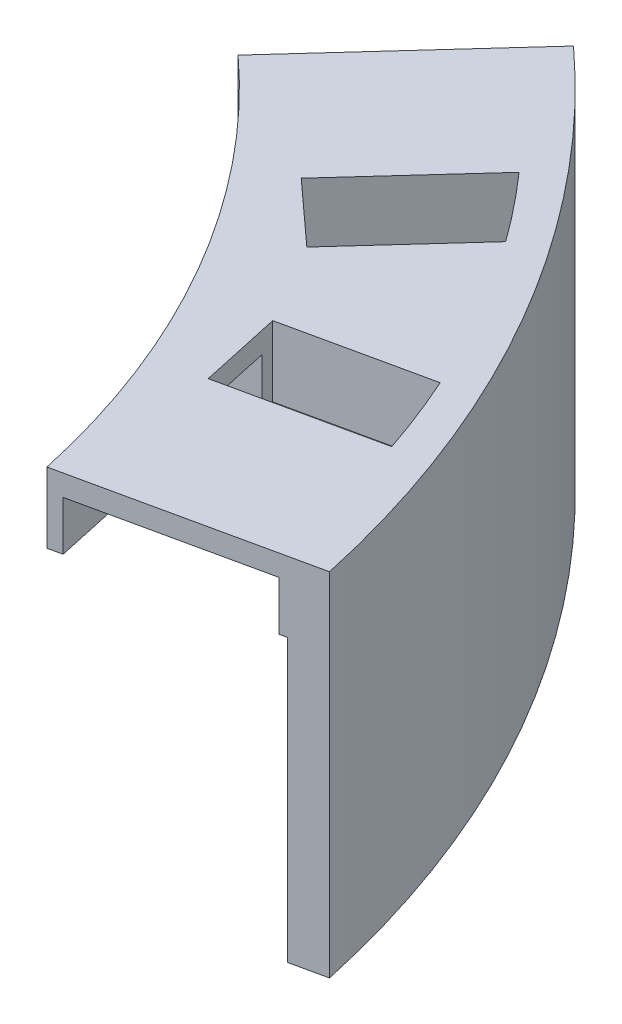
ISO-10303-21;
HEADER;
FILE_DESCRIPTION(('STEP AP214'),'2;1');
FILE_NAME('part.step','',(''),(''),'','','');
FILE_SCHEMA(('AUTOMOTIVE_DESIGN { 1 0 10303 214 1 1 1 1 }'));
ENDSEC;
DATA;
#1=APPLICATION_CONTEXT('core data for automotive mechanical design processes');
#2=APPLICATION_PROTOCOL_DEFINITION('international standard','automotive_design',2000,#1);
#3=PRODUCT_CONTEXT('',#1,'mechanical');
#4=PRODUCT('Part','Part','',(#3));
#5=PRODUCT_RELATED_PRODUCT_CATEGORY('part','',(#4));
#6=PRODUCT_DEFINITION_FORMATION('','',#4);
#7=PRODUCT_DEFINITION_CONTEXT('part definition',#1,'design');
#8=PRODUCT_DEFINITION('design','',#6,#7);
#9=PRODUCT_DEFINITION_SHAPE('','',#8);
#10=(LENGTH_UNIT() NAMED_UNIT(*) SI_UNIT(.MILLI.,.METRE.));
#11=(NAMED_UNIT(*) PLANE_ANGLE_UNIT() SI_UNIT($,.RADIAN.));
#12=(NAMED_UNIT(*) SI_UNIT($,.STERADIAN.) SOLID_ANGLE_UNIT());
#13=UNCERTAINTY_MEASURE_WITH_UNIT(LENGTH_MEASURE(1.E-05),#10,'distance_accuracy_value','');
#14=(GEOMETRIC_REPRESENTATION_CONTEXT(3) GLOBAL_UNCERTAINTY_ASSIGNED_CONTEXT((#13)) GLOBAL_UNIT_ASSIGNED_CONTEXT((#10,
#11,#12)) REPRESENTATION_CONTEXT('',''));
#15=CARTESIAN_POINT('',(0.,0.,0.));
#16=DIRECTION('',(0.,0.,1.));
#17=DIRECTION('',(1.,0.,0.));
#18=AXIS2_PLACEMENT_3D('',#15,#16,#17);
#19=CARTESIAN_POINT('',(169.451754353289,157.279655442511,334.961358152761));
#20=DIRECTION('',(0.,1.,0.));
#21=DIRECTION('',(0.,0.,1.));
#22=AXIS2_PLACEMENT_3D('',#19,#20,#21);
#23=PLANE('',#22);
#24=DIRECTION('',(-0.673038180934669,0.,0.739607738604831));
#25=VECTOR('',#24,1.);
#26=CARTESIAN_POINT('',(249.934035397751,157.279655442511,269.842653238576));
#27=LINE('',#26,#25);
#28=CARTESIAN_POINT('',(249.934035397751,157.279655442511,269.842653238576));
#29=VERTEX_POINT('',#28);
#30=CARTESIAN_POINT('',(244.783731583093,157.279655442511,275.50236863867));
#31=VERTEX_POINT('',#30);
#32=EDGE_CURVE('E277',#29,#31,#27,.T.);
#33=ORIENTED_EDGE('',*,*,#32,.T.);
#34=CARTESIAN_POINT('',(146.661612148435,157.279655442511,348.119252889603));
#35=DIRECTION('',(0.,-1.,0.));
#36=DIRECTION('',(0.,0.,1.));
#37=AXIS2_PLACEMENT_3D('',#34,#35,#36);
#38=CIRCLE('',#37,122.070316623914);
#39=CARTESIAN_POINT('',(228.819595995114,157.279655442511,257.835102060615));
#40=VERTEX_POINT('',#39);
#41=EDGE_CURVE('E404',#40,#31,#38,.T.);
#42=ORIENTED_EDGE('',*,*,#41,.F.);
#43=DIRECTION('',(-0.673038180934674,0.,0.739607738604826));
#44=VECTOR('',#43,1.);
#45=CARTESIAN_POINT('',(228.819595995114,157.279655442511,257.835102060615));
#46=LINE('',#45,#44);
#47=CARTESIAN_POINT('',(230.165672356983,157.279655442511,256.355886583406));
#48=VERTEX_POINT('',#47);
#49=EDGE_CURVE('E401',#48,#40,#46,.T.);
#50=ORIENTED_EDGE('',*,*,#49,.F.);
#51=DIRECTION('',(0.739607738604827,0.,0.673038180934674));
#52=VECTOR('',#51,1.);
#53=CARTESIAN_POINT('',(230.165672356983,157.279655442511,256.355886583406));
#54=LINE('',#53,#52);
#55=CARTESIAN_POINT('',(239.040965220241,157.279655442511,264.432344754622));
#56=VERTEX_POINT('',#55);
#57=EDGE_CURVE('E312',#48,#56,#54,.T.);
#58=ORIENTED_EDGE('',*,*,#57,.T.);
#59=DIRECTION('',(0.673038180934674,0.,-0.739607738604827));
#60=VECTOR('',#59,1.);
#61=CARTESIAN_POINT('',(259.905148829216,157.279655442511,241.504504857872));
#62=LINE('',#61,#60);
#63=CARTESIAN_POINT('',(256.496872448256,157.279655442511,245.249890570108));
#64=VERTEX_POINT('',#63);
#65=EDGE_CURVE('E340',#56,#64,#62,.T.);
#66=ORIENTED_EDGE('',*,*,#65,.T.);
#67=CARTESIAN_POINT('',(169.451754353291,157.279655442511,334.96135815276));
#68=DIRECTION('',(0.,1.,0.));
#69=DIRECTION('',(0.,0.,1.));
#70=AXIS2_PLACEMENT_3D('',#67,#68,#69);
#71=CIRCLE('',#70,124.999999999998);
#72=CARTESIAN_POINT('',(247.492190491782,157.279655442511,237.315619242587));
#73=VERTEX_POINT('',#72);
#74=EDGE_CURVE('E254',#64,#73,#71,.T.);
#75=ORIENTED_EDGE('',*,*,#74,.T.);
#76=DIRECTION('',(0.673038180934676,0.,-0.739607738604825));
#77=VECTOR('',#76,1.);
#78=CARTESIAN_POINT('',(247.492190491782,157.279655442511,237.315619242587));
#79=LINE('',#78,#77);
#80=CARTESIAN_POINT('',(248.165228672717,157.279655442511,236.576011503982));
#81=VERTEX_POINT('',#80);
#82=EDGE_CURVE('E280',#73,#81,#79,.T.);
#83=ORIENTED_EDGE('',*,*,#82,.T.);
#84=CARTESIAN_POINT('',(168.91314031717,157.279655442511,335.272327111504));
#85=DIRECTION('',(0.,-1.,0.));
#86=DIRECTION('',(0.,0.,-1.));
#87=AXIS2_PLACEMENT_3D('',#84,#85,#86);
#88=CIRCLE('',#87,126.577471230922);
#89=CARTESIAN_POINT('',(294.012701070983,157.279655442511,315.98616309639));
#90=VERTEX_POINT('',#89);
#91=EDGE_CURVE('E284',#81,#90,#88,.T.);
#92=ORIENTED_EDGE('',*,*,#91,.T.);
#93=DIRECTION('',(-0.977038180934683,0.,0.213064293103856));
#94=VECTOR('',#93,1.);
#95=CARTESIAN_POINT('',(293.035662890048,157.279655442511,316.199227389494));
#96=LINE('',#95,#94);
#97=CARTESIAN_POINT('',(293.035662890048,157.279655442511,316.199227389494));
#98=VERTEX_POINT('',#97);
#99=EDGE_CURVE('E287',#90,#98,#96,.T.);
#100=ORIENTED_EDGE('',*,*,#99,.T.);
#101=CARTESIAN_POINT('',(290.666723338133,157.279655442511,304.433808398428));
#102=VERTEX_POINT('',#101);
#103=EDGE_CURVE('E278',#98,#102,#71,.T.);
#104=ORIENTED_EDGE('',*,*,#103,.T.);
#105=DIRECTION('',(0.977038180934676,0.,-0.21306429310389));
#106=VECTOR('',#105,1.);
#107=CARTESIAN_POINT('',(168.599497180874,157.279655442511,331.053205429022));
#108=LINE('',#107,#106);
#109=CARTESIAN_POINT('',(265.266137429277,157.279655442511,309.972955165362));
#110=VERTEX_POINT('',#109);
#111=EDGE_CURVE('E438',#110,#102,#108,.T.);
#112=ORIENTED_EDGE('',*,*,#111,.F.);
#113=DIRECTION('',(0.213064293103889,0.,0.977038180934676));
#114=VECTOR('',#113,1.);
#115=CARTESIAN_POINT('',(267.822908946523,157.279655442511,321.697413336578));
#116=LINE('',#115,#114);
#117=CARTESIAN_POINT('',(267.822908946523,157.279655442511,321.697413336578));
#118=VERTEX_POINT('',#117);
#119=EDGE_CURVE('E324',#110,#118,#116,.T.);
#120=ORIENTED_EDGE('',*,*,#119,.T.);
#121=DIRECTION('',(0.977038180934675,0.,-0.213064293103891));
#122=VECTOR('',#121,1.);
#123=CARTESIAN_POINT('',(293.035662890048,157.279655442511,316.199227389494));
#124=LINE('',#123,#122);
#125=CARTESIAN_POINT('',(265.928972248784,157.279655442511,322.110427169161));
#126=VERTEX_POINT('',#125);
#127=EDGE_CURVE('E367',#126,#118,#124,.T.);
#128=ORIENTED_EDGE('',*,*,#127,.F.);
#129=CARTESIAN_POINT('',(258.610738370746,157.279655442511,299.451446911485));
#130=VERTEX_POINT('',#129);
#131=EDGE_CURVE('E403',#130,#126,#38,.T.);
#132=ORIENTED_EDGE('',*,*,#131,.F.);
#133=DIRECTION('',(0.977038180934676,0.,-0.213064293103888));
#134=VECTOR('',#133,1.);
#135=CARTESIAN_POINT('',(266.087347592747,157.279655442511,297.821010670829));
#136=LINE('',#135,#134);
#137=CARTESIAN_POINT('',(266.087347592747,157.279655442511,297.821010670829));
#138=VERTEX_POINT('',#137);
#139=EDGE_CURVE('E262',#130,#138,#136,.T.);
#140=ORIENTED_EDGE('',*,*,#139,.T.);
#141=DIRECTION('',(-0.213064293103888,0.,-0.977038180934676));
#142=VECTOR('',#141,1.);
#143=CARTESIAN_POINT('',(263.956704661708,157.279655442511,288.050628861483));
#144=LINE('',#143,#142);
#145=CARTESIAN_POINT('',(266.513476178954,157.279655442511,299.775087032699));
#146=VERTEX_POINT('',#145);
#147=EDGE_CURVE('E388',#146,#138,#144,.T.);
#148=ORIENTED_EDGE('',*,*,#147,.F.);
#149=DIRECTION('',(-0.977038180934676,0.,0.213064293103886));
#150=VECTOR('',#149,1.);
#151=CARTESIAN_POINT('',(266.513476178954,157.279655442511,299.775087032699));
#152=LINE('',#151,#150);
#153=CARTESIAN_POINT('',(287.927468650043,157.279655442511,295.105303131296));
#154=VERTEX_POINT('',#153);
#155=EDGE_CURVE('E363',#154,#146,#152,.T.);
#156=ORIENTED_EDGE('',*,*,#155,.F.);
#157=CARTESIAN_POINT('',(283.497468280402,157.279655442511,283.789342999405));
#158=VERTEX_POINT('',#157);
#159=EDGE_CURVE('E281',#154,#158,#71,.T.);
#160=ORIENTED_EDGE('',*,*,#159,.T.);
#161=DIRECTION('',(0.977038180934676,0.,-0.213064293103887));
#162=VECTOR('',#161,1.);
#163=CARTESIAN_POINT('',(283.497468280401,157.279655442511,283.789342999405));
#164=LINE('',#163,#162);
#165=CARTESIAN_POINT('',(263.956704661708,157.279655442511,288.050628861483));
#166=VERTEX_POINT('',#165);
#167=EDGE_CURVE('E391',#166,#158,#164,.T.);
#168=ORIENTED_EDGE('',*,*,#167,.F.);
#169=CARTESIAN_POINT('',(264.382833247916,157.279655442511,290.004705223352));
#170=VERTEX_POINT('',#169);
#171=EDGE_CURVE('E387',#170,#166,#144,.T.);
#172=ORIENTED_EDGE('',*,*,#171,.F.);
#173=DIRECTION('',(-0.977038180934676,0.,0.213064293103888));
#174=VECTOR('',#173,1.);
#175=CARTESIAN_POINT('',(264.382833247916,157.279655442511,290.004705223352));
#176=LINE('',#175,#174);
#177=CARTESIAN_POINT('',(255.084107945075,157.279655442511,292.03249325874));
#178=VERTEX_POINT('',#177);
#179=EDGE_CURVE('E268',#170,#178,#176,.T.);
#180=ORIENTED_EDGE('',*,*,#179,.T.);
#181=CARTESIAN_POINT('',(249.445418703033,157.279655442511,282.265997003432));
#182=VERTEX_POINT('',#181);
#183=EDGE_CURVE('E407',#182,#178,#38,.T.);
#184=ORIENTED_EDGE('',*,*,#183,.F.);
#185=DIRECTION('',(0.67303818093467,0.,-0.73960773860483));
#186=VECTOR('',#185,1.);
#187=CARTESIAN_POINT('',(255.85089730659,157.279655442511,275.226958686053));
#188=LINE('',#187,#186);
#189=CARTESIAN_POINT('',(255.85089730659,157.279655442511,275.226958686053));
#190=VERTEX_POINT('',#189);
#191=EDGE_CURVE('E457',#182,#190,#188,.T.);
#192=ORIENTED_EDGE('',*,*,#191,.T.);
#193=DIRECTION('',(-0.73960773860483,0.,-0.67303818093467));
#194=VECTOR('',#193,1.);
#195=CARTESIAN_POINT('',(248.454819920542,157.279655442511,268.496576876706));
#196=LINE('',#195,#194);
#197=CARTESIAN_POINT('',(257.3301127838,157.279655442511,276.573035047922));
#198=VERTEX_POINT('',#197);
#199=EDGE_CURVE('E251',#198,#190,#196,.T.);
#200=ORIENTED_EDGE('',*,*,#199,.F.);
#201=DIRECTION('',(-0.673038180934673,0.,0.739607738604827));
#202=VECTOR('',#201,1.);
#203=CARTESIAN_POINT('',(257.3301127838,157.279655442511,276.573035047922));
#204=LINE('',#203,#202);
#205=CARTESIAN_POINT('',(270.790876402493,157.279655442511,261.780880275826));
#206=VERTEX_POINT('',#205);
#207=EDGE_CURVE('E394',#206,#198,#204,.T.);
#208=ORIENTED_EDGE('',*,*,#207,.F.);
#209=CARTESIAN_POINT('',(263.205967644884,157.279655442511,252.286407350996));
#210=VERTEX_POINT('',#209);
#211=EDGE_CURVE('E488',#206,#210,#71,.T.);
#212=ORIENTED_EDGE('',*,*,#211,.T.);
#213=DIRECTION('',(0.673038180934672,0.,-0.739607738604828));
#214=VECTOR('',#213,1.);
#215=CARTESIAN_POINT('',(263.205967644884,157.279655442511,252.286407350996));
#216=LINE('',#215,#214);
#217=CARTESIAN_POINT('',(248.454819920542,157.279655442511,268.496576876706));
#218=VERTEX_POINT('',#217);
#219=EDGE_CURVE('E398',#218,#210,#216,.T.);
#220=ORIENTED_EDGE('',*,*,#219,.F.);
#221=EDGE_CURVE('E396',#29,#218,#196,.T.);
#222=ORIENTED_EDGE('',*,*,#221,.F.);
#223=EDGE_LOOP('',(#33,#42,#50,#58,#66,#75,#83,#92,#100,#104,#112,#120,#128,#132,#140,#148,#156,
#160,#168,#172,#180,#184,#192,#200,#208,#212,#220,#222));
#224=FACE_BOUND('',#223,.T.);
#225=ADVANCED_FACE('F36',(#224),#23,.F.);
#226=CARTESIAN_POINT('',(263.956704661708,167.279655442511,288.050628861483));
#227=DIRECTION('',(-0.977038180934676,0.,0.213064293103888));
#228=DIRECTION('',(0.213064293103888,0.,0.977038180934676));
#229=AXIS2_PLACEMENT_3D('',#226,#227,#228);
#230=PLANE('',#229);
#231=DIRECTION('',(0.,-1.,0.));
#232=VECTOR('',#231,1.);
#233=CARTESIAN_POINT('',(264.382833247916,164.279655442511,290.004705223352));
#234=LINE('',#233,#232);
#235=CARTESIAN_POINT('',(264.382833247916,164.279655442511,290.004705223352));
#236=VERTEX_POINT('',#235);
#237=EDGE_CURVE('E267',#236,#170,#234,.T.);
#238=ORIENTED_EDGE('',*,*,#237,.T.);
#239=ORIENTED_EDGE('',*,*,#171,.T.);
#240=DIRECTION('',(0.,-1.,0.));
#241=VECTOR('',#240,1.);
#242=CARTESIAN_POINT('',(263.956704661708,167.279655442511,288.050628861483));
#243=LINE('',#242,#241);
#244=CARTESIAN_POINT('',(263.956704661708,167.279655442511,288.050628861483));
#245=VERTEX_POINT('',#244);
#246=EDGE_CURVE('E429',#245,#166,#243,.T.);
#247=ORIENTED_EDGE('',*,*,#246,.F.);
#248=DIRECTION('',(-0.213064293103888,0.,-0.977038180934676));
#249=VECTOR('',#248,1.);
#250=CARTESIAN_POINT('',(263.956704661708,167.279655442511,288.050628861483));
#251=LINE('',#250,#249);
#252=CARTESIAN_POINT('',(266.513476178954,167.279655442511,299.775087032699));
#253=VERTEX_POINT('',#252);
#254=EDGE_CURVE('E366',#253,#245,#251,.T.);
#255=ORIENTED_EDGE('',*,*,#254,.F.);
#256=DIRECTION('',(0.,-1.,0.));
#257=VECTOR('',#256,1.);
#258=CARTESIAN_POINT('',(266.513476178954,167.279655442511,299.775087032699));
#259=LINE('',#258,#257);
#260=EDGE_CURVE('E432',#253,#146,#259,.T.);
#261=ORIENTED_EDGE('',*,*,#260,.T.);
#262=ORIENTED_EDGE('',*,*,#147,.T.);
#263=DIRECTION('',(0.,-1.,0.));
#264=VECTOR('',#263,1.);
#265=CARTESIAN_POINT('',(266.087347592747,164.279655442511,297.821010670829));
#266=LINE('',#265,#264);
#267=CARTESIAN_POINT('',(266.087347592747,164.279655442511,297.821010670829));
#268=VERTEX_POINT('',#267);
#269=EDGE_CURVE('E275',#268,#138,#266,.T.);
#270=ORIENTED_EDGE('',*,*,#269,.F.);
#271=DIRECTION('',(-0.213064293103887,0.,-0.977038180934676));
#272=VECTOR('',#271,1.);
#273=CARTESIAN_POINT('',(264.382833247916,164.279655442511,290.004705223352));
#274=LINE('',#273,#272);
#275=EDGE_CURVE('E264',#268,#236,#274,.T.);
#276=ORIENTED_EDGE('',*,*,#275,.T.);
#277=EDGE_LOOP('',(#238,#239,#247,#255,#261,#262,#270,#276));
#278=FACE_BOUND('',#277,.T.);
#279=ADVANCED_FACE('F503',(#278),#230,.F.);
#280=CARTESIAN_POINT('',(248.454819920542,167.279655442511,268.496576876706));
#281=DIRECTION('',(-0.67303818093467,0.,0.73960773860483));
#282=DIRECTION('',(0.73960773860483,0.,0.67303818093467));
#283=AXIS2_PLACEMENT_3D('',#280,#281,#282);
#284=PLANE('',#283);
#285=DIRECTION('',(0.,-1.,0.));
#286=VECTOR('',#285,1.);
#287=CARTESIAN_POINT('',(249.934035397751,164.279655442511,269.842653238576));
#288=LINE('',#287,#286);
#289=CARTESIAN_POINT('',(249.934035397751,164.279655442511,269.842653238576));
#290=VERTEX_POINT('',#289);
#291=EDGE_CURVE('E245',#290,#29,#288,.T.);
#292=ORIENTED_EDGE('',*,*,#291,.T.);
#293=ORIENTED_EDGE('',*,*,#221,.T.);
#294=DIRECTION('',(0.,-1.,0.));
#295=VECTOR('',#294,1.);
#296=CARTESIAN_POINT('',(248.454819920542,167.279655442511,268.496576876706));
#297=LINE('',#296,#295);
#298=CARTESIAN_POINT('',(248.454819920542,167.279655442511,268.496576876706));
#299=VERTEX_POINT('',#298);
#300=EDGE_CURVE('E418',#299,#218,#297,.T.);
#301=ORIENTED_EDGE('',*,*,#300,.F.);
#302=DIRECTION('',(-0.73960773860483,0.,-0.67303818093467));
#303=VECTOR('',#302,1.);
#304=CARTESIAN_POINT('',(248.454819920542,167.279655442511,268.496576876706));
#305=LINE('',#304,#303);
#306=CARTESIAN_POINT('',(257.3301127838,167.279655442511,276.573035047922));
#307=VERTEX_POINT('',#306);
#308=EDGE_CURVE('E374',#307,#299,#305,.T.);
#309=ORIENTED_EDGE('',*,*,#308,.F.);
#310=DIRECTION('',(0.,-1.,0.));
#311=VECTOR('',#310,1.);
#312=CARTESIAN_POINT('',(257.3301127838,167.279655442511,276.573035047922));
#313=LINE('',#312,#311);
#314=EDGE_CURVE('E421',#307,#198,#313,.T.);
#315=ORIENTED_EDGE('',*,*,#314,.T.);
#316=ORIENTED_EDGE('',*,*,#199,.T.);
#317=DIRECTION('',(0.,-1.,0.));
#318=VECTOR('',#317,1.);
#319=CARTESIAN_POINT('',(255.85089730659,164.279655442511,275.226958686053));
#320=LINE('',#319,#318);
#321=CARTESIAN_POINT('',(255.85089730659,164.279655442511,275.226958686053));
#322=VERTEX_POINT('',#321);
#323=EDGE_CURVE('E232',#322,#190,#320,.T.);
#324=ORIENTED_EDGE('',*,*,#323,.F.);
#325=DIRECTION('',(-0.73960773860483,0.,-0.67303818093467));
#326=VECTOR('',#325,1.);
#327=CARTESIAN_POINT('',(249.934035397751,164.279655442511,269.842653238576));
#328=LINE('',#327,#326);
#329=EDGE_CURVE('E236',#322,#290,#328,.T.);
#330=ORIENTED_EDGE('',*,*,#329,.T.);
#331=EDGE_LOOP('',(#292,#293,#301,#309,#315,#316,#324,#330));
#332=FACE_BOUND('',#331,.T.);
#333=ADVANCED_FACE('F248',(#332),#284,.F.);
#334=CARTESIAN_POINT('',(146.661612148435,167.279655442511,348.119252889603));
#335=DIRECTION('',(0.,-1.,0.));
#336=DIRECTION('',(0.,0.,-1.));
#337=AXIS2_PLACEMENT_3D('',#334,#335,#336);
#338=CYLINDRICAL_SURFACE('',#337,122.070316623914);
#339=DIRECTION('',(0.,-1.,0.));
#340=VECTOR('',#339,1.);
#341=CARTESIAN_POINT('',(244.783731583093,167.279655442511,275.50236863867));
#342=LINE('',#341,#340);
#343=CARTESIAN_POINT('',(244.783731583093,164.279655442511,275.50236863867));
#344=VERTEX_POINT('',#343);
#345=EDGE_CURVE('E11',#344,#31,#342,.T.);
#346=ORIENTED_EDGE('',*,*,#345,.F.);
#347=CARTESIAN_POINT('',(146.661612148435,164.279655442511,348.119252889603));
#348=DIRECTION('',(0.,1.,0.));
#349=DIRECTION('',(0.,0.,1.));
#350=AXIS2_PLACEMENT_3D('',#347,#348,#349);
#351=CIRCLE('',#350,122.070316623914);
#352=CARTESIAN_POINT('',(249.445418703033,164.279655442511,282.265997003432));
#353=VERTEX_POINT('',#352);
#354=EDGE_CURVE('E448',#344,#353,#351,.F.);
#355=ORIENTED_EDGE('',*,*,#354,.T.);
#356=DIRECTION('',(0.,-1.,0.));
#357=VECTOR('',#356,1.);
#358=CARTESIAN_POINT('',(249.445418703033,167.279655442511,282.265997003432));
#359=LINE('',#358,#357);
#360=EDGE_CURVE('E44',#182,#353,#359,.F.);
#361=ORIENTED_EDGE('',*,*,#360,.F.);
#362=ORIENTED_EDGE('',*,*,#183,.T.);
#363=DIRECTION('',(0.,-1.,0.));
#364=VECTOR('',#363,1.);
#365=CARTESIAN_POINT('',(255.084107945075,167.279655442511,292.03249325874));
#366=LINE('',#365,#364);
#367=CARTESIAN_POINT('',(255.084107945075,164.279655442511,292.03249325874));
#368=VERTEX_POINT('',#367);
#369=EDGE_CURVE('E446',#368,#178,#366,.T.);
#370=ORIENTED_EDGE('',*,*,#369,.F.);
#371=CARTESIAN_POINT('',(146.661612148435,164.279655442511,348.119252889603));
#372=DIRECTION('',(0.,1.,0.));
#373=DIRECTION('',(0.,0.,1.));
#374=AXIS2_PLACEMENT_3D('',#371,#372,#373);
#375=CIRCLE('',#374,122.070316623914);
#376=CARTESIAN_POINT('',(258.610738370746,164.279655442511,299.451446911485));
#377=VERTEX_POINT('',#376);
#378=EDGE_CURVE('E441',#368,#377,#375,.F.);
#379=ORIENTED_EDGE('',*,*,#378,.T.);
#380=DIRECTION('',(0.,-1.,0.));
#381=VECTOR('',#380,1.);
#382=CARTESIAN_POINT('',(258.610738370746,167.279655442511,299.451446911485));
#383=LINE('',#382,#381);
#384=EDGE_CURVE('E444',#130,#377,#383,.F.);
#385=ORIENTED_EDGE('',*,*,#384,.F.);
#386=ORIENTED_EDGE('',*,*,#131,.T.);
#387=DIRECTION('',(0.,-1.,0.));
#388=VECTOR('',#387,1.);
#389=CARTESIAN_POINT('',(265.928972248784,167.279655442511,322.110427169161));
#390=LINE('',#389,#388);
#391=CARTESIAN_POINT('',(265.928972248784,167.279655442511,322.110427169161));
#392=VERTEX_POINT('',#391);
#393=EDGE_CURVE('E385',#392,#126,#390,.T.);
#394=ORIENTED_EDGE('',*,*,#393,.F.);
#395=CARTESIAN_POINT('',(146.661612148435,167.279655442511,348.119252889603));
#396=DIRECTION('',(0.,-1.,0.));
#397=DIRECTION('',(0.,0.,1.));
#398=AXIS2_PLACEMENT_3D('',#395,#396,#397);
#399=CIRCLE('',#398,122.070316623914);
#400=CARTESIAN_POINT('',(228.819595995114,167.279655442511,257.835102060615));
#401=VERTEX_POINT('',#400);
#402=EDGE_CURVE('E381',#401,#392,#399,.T.);
#403=ORIENTED_EDGE('',*,*,#402,.F.);
#404=DIRECTION('',(0.,-1.,0.));
#405=VECTOR('',#404,1.);
#406=CARTESIAN_POINT('',(228.819595995114,167.279655442511,257.835102060615));
#407=LINE('',#406,#405);
#408=EDGE_CURVE('E412',#401,#40,#407,.T.);
#409=ORIENTED_EDGE('',*,*,#408,.T.);
#410=ORIENTED_EDGE('',*,*,#41,.T.);
#411=EDGE_LOOP('',(#346,#355,#361,#362,#370,#379,#385,#386,#394,#403,#409,#410));
#412=FACE_BOUND('',#411,.T.);
#413=ADVANCED_FACE('F451',(#412),#338,.F.);
#414=CARTESIAN_POINT('',(169.45175435329,117.279655442511,334.961358152761));
#415=DIRECTION('',(0.,1.,0.));
#416=DIRECTION('',(0.,0.,1.));
#417=AXIS2_PLACEMENT_3D('',#414,#415,#416);
#418=CYLINDRICAL_SURFACE('',#417,125.);
#419=ORIENTED_EDGE('',*,*,#103,.F.);
#420=DIRECTION('',(0.,1.,0.));
#421=VECTOR('',#420,1.);
#422=CARTESIAN_POINT('',(293.035662890048,117.279655442511,316.199227389494));
#423=LINE('',#422,#421);
#424=CARTESIAN_POINT('',(293.035662890048,164.279655442511,316.199227389494));
#425=VERTEX_POINT('',#424);
#426=EDGE_CURVE('E304',#98,#425,#423,.T.);
#427=ORIENTED_EDGE('',*,*,#426,.T.);
#428=CARTESIAN_POINT('',(169.451754353289,164.279655442511,334.961358152761));
#429=DIRECTION('',(0.,1.,0.));
#430=DIRECTION('',(0.,0.,1.));
#431=AXIS2_PLACEMENT_3D('',#428,#429,#430);
#432=CIRCLE('',#431,125.);
#433=CARTESIAN_POINT('',(290.666723338133,164.279655442511,304.433808398428));
#434=VERTEX_POINT('',#433);
#435=EDGE_CURVE('E358',#425,#434,#432,.T.);
#436=ORIENTED_EDGE('',*,*,#435,.T.);
#437=DIRECTION('',(0.,-1.,0.));
#438=VECTOR('',#437,1.);
#439=CARTESIAN_POINT('',(290.666723338133,167.279655442511,304.433808398428));
#440=LINE('',#439,#438);
#441=EDGE_CURVE('E355',#102,#434,#440,.F.);
#442=ORIENTED_EDGE('',*,*,#441,.F.);
#443=EDGE_LOOP('',(#419,#427,#436,#442));
#444=FACE_BOUND('',#443,.T.);
#445=ADVANCED_FACE('F528',(#444),#418,.F.);
#446=ORIENTED_EDGE('',*,*,#159,.F.);
#447=DIRECTION('',(0.,-1.,0.));
#448=VECTOR('',#447,1.);
#449=CARTESIAN_POINT('',(287.927468650043,167.279655442511,295.105303131296));
#450=LINE('',#449,#448);
#451=CARTESIAN_POINT('',(287.927468650043,167.279655442511,295.105303131296));
#452=VERTEX_POINT('',#451);
#453=EDGE_CURVE('E435',#452,#154,#450,.T.);
#454=ORIENTED_EDGE('',*,*,#453,.F.);
#455=CARTESIAN_POINT('',(169.45175435329,167.279655442511,334.961358152761));
#456=DIRECTION('',(0.,-1.,0.));
#457=DIRECTION('',(0.,0.,-1.));
#458=AXIS2_PLACEMENT_3D('',#455,#456,#457);
#459=CIRCLE('',#458,125.);
#460=CARTESIAN_POINT('',(283.497468280401,167.279655442511,283.789342999405));
#461=VERTEX_POINT('',#460);
#462=EDGE_CURVE('E293',#461,#452,#459,.T.);
#463=ORIENTED_EDGE('',*,*,#462,.F.);
#464=DIRECTION('',(0.,-1.,0.));
#465=VECTOR('',#464,1.);
#466=CARTESIAN_POINT('',(283.497468280401,167.279655442511,283.789342999405));
#467=LINE('',#466,#465);
#468=EDGE_CURVE('E426',#461,#158,#467,.T.);
#469=ORIENTED_EDGE('',*,*,#468,.T.);
#470=EDGE_LOOP('',(#446,#454,#463,#469));
#471=FACE_BOUND('',#470,.T.);
#472=ADVANCED_FACE('F496',(#471),#418,.F.);
#473=ORIENTED_EDGE('',*,*,#211,.F.);
#474=DIRECTION('',(0.,-1.,0.));
#475=VECTOR('',#474,1.);
#476=CARTESIAN_POINT('',(270.790876402493,167.279655442511,261.780880275826));
#477=LINE('',#476,#475);
#478=CARTESIAN_POINT('',(270.790876402493,167.279655442511,261.780880275826));
#479=VERTEX_POINT('',#478);
#480=EDGE_CURVE('E423',#479,#206,#477,.T.);
#481=ORIENTED_EDGE('',*,*,#480,.F.);
#482=CARTESIAN_POINT('',(263.205967644884,167.279655442511,252.286407350996));
#483=VERTEX_POINT('',#482);
#484=EDGE_CURVE('E307',#483,#479,#459,.T.);
#485=ORIENTED_EDGE('',*,*,#484,.F.);
#486=DIRECTION('',(0.,-1.,0.));
#487=VECTOR('',#486,1.);
#488=CARTESIAN_POINT('',(263.205967644884,167.279655442511,252.286407350996));
#489=LINE('',#488,#487);
#490=EDGE_CURVE('E415',#483,#210,#489,.T.);
#491=ORIENTED_EDGE('',*,*,#490,.T.);
#492=EDGE_LOOP('',(#473,#481,#485,#491));
#493=FACE_BOUND('',#492,.T.);
#494=ADVANCED_FACE('F555',(#493),#418,.F.);
#495=CARTESIAN_POINT('',(228.819595995114,167.279655442511,257.835102060615));
#496=DIRECTION('',(0.739607738604826,0.,0.673038180934674));
#497=DIRECTION('',(0.673038180934674,0.,-0.739607738604826));
#498=AXIS2_PLACEMENT_3D('',#495,#496,#497);
#499=PLANE('',#498);
#500=DIRECTION('',(-0.673038180934676,0.,0.739607738604825));
#501=VECTOR('',#500,1.);
#502=CARTESIAN_POINT('',(251.53041957739,117.279655442511,232.877972810958));
#503=LINE('',#502,#501);
#504=CARTESIAN_POINT('',(251.53041957739,117.279655442511,232.877972810958));
#505=VERTEX_POINT('',#504);
#506=CARTESIAN_POINT('',(248.165228672717,117.279655442511,236.576011503982));
#507=VERTEX_POINT('',#506);
#508=EDGE_CURVE('E301',#505,#507,#503,.T.);
#509=ORIENTED_EDGE('',*,*,#508,.T.);
#510=DIRECTION('',(0.,-1.,0.));
#511=VECTOR('',#510,1.);
#512=CARTESIAN_POINT('',(248.165228672717,157.279655442511,236.576011503982));
#513=LINE('',#512,#511);
#514=EDGE_CURVE('E288',#81,#507,#513,.T.);
#515=ORIENTED_EDGE('',*,*,#514,.F.);
#516=ORIENTED_EDGE('',*,*,#82,.F.);
#517=DIRECTION('',(0.,1.,0.));
#518=VECTOR('',#517,1.);
#519=CARTESIAN_POINT('',(247.492190491782,117.279655442511,237.315619242587));
#520=LINE('',#519,#518);
#521=CARTESIAN_POINT('',(247.492190491782,164.279655442511,237.315619242587));
#522=VERTEX_POINT('',#521);
#523=EDGE_CURVE('E310',#73,#522,#520,.T.);
#524=ORIENTED_EDGE('',*,*,#523,.T.);
#525=DIRECTION('',(-0.673038180934673,0.,0.739607738604827));
#526=VECTOR('',#525,1.);
#527=CARTESIAN_POINT('',(251.029855965958,164.279655442511,233.428046686656));
#528=LINE('',#527,#526);
#529=CARTESIAN_POINT('',(230.165672356983,164.279655442511,256.355886583406));
#530=VERTEX_POINT('',#529);
#531=EDGE_CURVE('E336',#522,#530,#528,.T.);
#532=ORIENTED_EDGE('',*,*,#531,.T.);
#533=DIRECTION('',(0.,-1.,0.));
#534=VECTOR('',#533,1.);
#535=CARTESIAN_POINT('',(230.165672356983,164.279655442511,256.355886583406));
#536=LINE('',#535,#534);
#537=EDGE_CURVE('E331',#530,#48,#536,.T.);
#538=ORIENTED_EDGE('',*,*,#537,.T.);
#539=ORIENTED_EDGE('',*,*,#49,.T.);
#540=ORIENTED_EDGE('',*,*,#408,.F.);
#541=DIRECTION('',(-0.673038180934674,0.,0.739607738604826));
#542=VECTOR('',#541,1.);
#543=CARTESIAN_POINT('',(228.819595995114,167.279655442511,257.835102060615));
#544=LINE('',#543,#542);
#545=CARTESIAN_POINT('',(251.53041957739,167.279655442511,232.877972810958));
#546=VERTEX_POINT('',#545);
#547=EDGE_CURVE('E379',#546,#401,#544,.T.);
#548=ORIENTED_EDGE('',*,*,#547,.F.);
#549=DIRECTION('',(0.,1.,0.));
#550=VECTOR('',#549,1.);
#551=CARTESIAN_POINT('',(251.53041957739,117.279655442511,232.877972810958));
#552=LINE('',#551,#550);
#553=EDGE_CURVE('E313',#505,#546,#552,.T.);
#554=ORIENTED_EDGE('',*,*,#553,.F.);
#555=EDGE_LOOP('',(#509,#515,#516,#524,#532,#538,#539,#540,#548,#554));
#556=FACE_BOUND('',#555,.T.);
#557=ADVANCED_FACE('F469',(#556),#499,.F.);
#558=CARTESIAN_POINT('',(293.035662890048,167.279655442511,316.199227389494));
#559=DIRECTION('',(-0.213064293103891,0.,-0.977038180934675));
#560=DIRECTION('',(-0.977038180934675,0.,0.213064293103891));
#561=AXIS2_PLACEMENT_3D('',#558,#559,#560);
#562=PLANE('',#561);
#563=ORIENTED_EDGE('',*,*,#99,.F.);
#564=DIRECTION('',(0.,-1.,0.));
#565=VECTOR('',#564,1.);
#566=CARTESIAN_POINT('',(294.012701070983,157.279655442511,315.98616309639));
#567=LINE('',#566,#565);
#568=CARTESIAN_POINT('',(294.012701070983,117.279655442511,315.98616309639));
#569=VERTEX_POINT('',#568);
#570=EDGE_CURVE('E290',#90,#569,#567,.T.);
#571=ORIENTED_EDGE('',*,*,#570,.T.);
#572=DIRECTION('',(0.977038180934678,0.,-0.213064293103878));
#573=VECTOR('',#572,1.);
#574=CARTESIAN_POINT('',(293.035662890048,117.279655442511,316.199227389494));
#575=LINE('',#574,#573);
#576=CARTESIAN_POINT('',(298.897891975657,117.279655442511,314.920841630871));
#577=VERTEX_POINT('',#576);
#578=EDGE_CURVE('E295',#569,#577,#575,.T.);
#579=ORIENTED_EDGE('',*,*,#578,.T.);
#580=DIRECTION('',(0.,1.,0.));
#581=VECTOR('',#580,1.);
#582=CARTESIAN_POINT('',(298.897891975657,117.279655442511,314.920841630871));
#583=LINE('',#582,#581);
#584=CARTESIAN_POINT('',(298.897891975657,167.279655442511,314.920841630871));
#585=VERTEX_POINT('',#584);
#586=EDGE_CURVE('E316',#577,#585,#583,.T.);
#587=ORIENTED_EDGE('',*,*,#586,.T.);
#588=DIRECTION('',(0.977038180934675,0.,-0.213064293103891));
#589=VECTOR('',#588,1.);
#590=CARTESIAN_POINT('',(293.035662890048,167.279655442511,316.199227389494));
#591=LINE('',#590,#589);
#592=EDGE_CURVE('E383',#392,#585,#591,.T.);
#593=ORIENTED_EDGE('',*,*,#592,.F.);
#594=ORIENTED_EDGE('',*,*,#393,.T.);
#595=ORIENTED_EDGE('',*,*,#127,.T.);
#596=DIRECTION('',(0.,-1.,0.));
#597=VECTOR('',#596,1.);
#598=CARTESIAN_POINT('',(267.822908946523,164.279655442511,321.697413336578));
#599=LINE('',#598,#597);
#600=CARTESIAN_POINT('',(267.822908946523,164.279655442511,321.697413336578));
#601=VERTEX_POINT('',#600);
#602=EDGE_CURVE('E328',#601,#118,#599,.T.);
#603=ORIENTED_EDGE('',*,*,#602,.F.);
#604=DIRECTION('',(0.977038180934675,0.,-0.213064293103891));
#605=VECTOR('',#604,1.);
#606=CARTESIAN_POINT('',(267.822908946523,164.279655442511,321.697413336578));
#607=LINE('',#606,#605);
#608=EDGE_CURVE('E320',#601,#425,#607,.T.);
#609=ORIENTED_EDGE('',*,*,#608,.T.);
#610=ORIENTED_EDGE('',*,*,#426,.F.);
#611=EDGE_LOOP('',(#563,#571,#579,#587,#593,#594,#595,#603,#609,#610));
#612=FACE_BOUND('',#611,.T.);
#613=ADVANCED_FACE('F511',(#612),#562,.F.);
#614=CARTESIAN_POINT('',(266.513476178954,167.279655442511,299.775087032699));
#615=DIRECTION('',(0.213064293103886,0.,0.977038180934676));
#616=DIRECTION('',(0.977038180934676,0.,-0.213064293103886));
#617=AXIS2_PLACEMENT_3D('',#614,#615,#616);
#618=PLANE('',#617);
#619=ORIENTED_EDGE('',*,*,#155,.T.);
#620=ORIENTED_EDGE('',*,*,#260,.F.);
#621=DIRECTION('',(-0.977038180934676,0.,0.213064293103886));
#622=VECTOR('',#621,1.);
#623=CARTESIAN_POINT('',(266.513476178954,167.279655442511,299.775087032699));
#624=LINE('',#623,#622);
#625=EDGE_CURVE('E364',#452,#253,#624,.T.);
#626=ORIENTED_EDGE('',*,*,#625,.F.);
#627=ORIENTED_EDGE('',*,*,#453,.T.);
#628=EDGE_LOOP('',(#619,#620,#626,#627));
#629=FACE_BOUND('',#628,.T.);
#630=ADVANCED_FACE('F38',(#629),#618,.F.);
#631=CARTESIAN_POINT('',(283.497468280401,167.279655442511,283.789342999405));
#632=DIRECTION('',(-0.213064293103887,0.,-0.977038180934676));
#633=DIRECTION('',(-0.977038180934676,0.,0.213064293103887));
#634=AXIS2_PLACEMENT_3D('',#631,#632,#633);
#635=PLANE('',#634);
#636=ORIENTED_EDGE('',*,*,#167,.T.);
#637=ORIENTED_EDGE('',*,*,#468,.F.);
#638=DIRECTION('',(0.977038180934676,0.,-0.213064293103887));
#639=VECTOR('',#638,1.);
#640=CARTESIAN_POINT('',(283.497468280401,167.279655442511,283.789342999405));
#641=LINE('',#640,#639);
#642=EDGE_CURVE('E369',#245,#461,#641,.T.);
#643=ORIENTED_EDGE('',*,*,#642,.F.);
#644=ORIENTED_EDGE('',*,*,#246,.T.);
#645=EDGE_LOOP('',(#636,#637,#643,#644));
#646=FACE_BOUND('',#645,.T.);
#647=ADVANCED_FACE('F499',(#646),#635,.F.);
#648=CARTESIAN_POINT('',(257.3301127838,167.279655442511,276.573035047922));
#649=DIRECTION('',(0.739607738604827,0.,0.673038180934673));
#650=DIRECTION('',(0.673038180934673,0.,-0.739607738604827));
#651=AXIS2_PLACEMENT_3D('',#648,#649,#650);
#652=PLANE('',#651);
#653=ORIENTED_EDGE('',*,*,#207,.T.);
#654=ORIENTED_EDGE('',*,*,#314,.F.);
#655=DIRECTION('',(-0.673038180934673,0.,0.739607738604827));
#656=VECTOR('',#655,1.);
#657=CARTESIAN_POINT('',(257.3301127838,167.279655442511,276.573035047922));
#658=LINE('',#657,#656);
#659=EDGE_CURVE('E372',#479,#307,#658,.T.);
#660=ORIENTED_EDGE('',*,*,#659,.F.);
#661=ORIENTED_EDGE('',*,*,#480,.T.);
#662=EDGE_LOOP('',(#653,#654,#660,#661));
#663=FACE_BOUND('',#662,.T.);
#664=ADVANCED_FACE('F559',(#663),#652,.F.);
#665=CARTESIAN_POINT('',(263.205967644884,167.279655442511,252.286407350996));
#666=DIRECTION('',(-0.739607738604828,0.,-0.673038180934672));
#667=DIRECTION('',(-0.673038180934672,0.,0.739607738604828));
#668=AXIS2_PLACEMENT_3D('',#665,#666,#667);
#669=PLANE('',#668);
#670=ORIENTED_EDGE('',*,*,#219,.T.);
#671=ORIENTED_EDGE('',*,*,#490,.F.);
#672=DIRECTION('',(0.673038180934672,0.,-0.739607738604828));
#673=VECTOR('',#672,1.);
#674=CARTESIAN_POINT('',(263.205967644884,167.279655442511,252.286407350996));
#675=LINE('',#674,#673);
#676=EDGE_CURVE('E376',#299,#483,#675,.T.);
#677=ORIENTED_EDGE('',*,*,#676,.F.);
#678=ORIENTED_EDGE('',*,*,#300,.T.);
#679=EDGE_LOOP('',(#670,#671,#677,#678));
#680=FACE_BOUND('',#679,.T.);
#681=ADVANCED_FACE('F556',(#680),#669,.F.);
#682=CARTESIAN_POINT('',(169.451754353289,167.279655442511,334.961358152761));
#683=DIRECTION('',(0.,1.,0.));
#684=DIRECTION('',(0.,0.,1.));
#685=AXIS2_PLACEMENT_3D('',#682,#683,#684);
#686=PLANE('',#685);
#687=CARTESIAN_POINT('',(146.661612148434,167.279655442511,348.119252889604));
#688=DIRECTION('',(0.,1.,0.));
#689=DIRECTION('',(0.,0.,-1.));
#690=AXIS2_PLACEMENT_3D('',#687,#688,#689);
#691=CIRCLE('',#690,155.814053941667);
#692=EDGE_CURVE('E298',#585,#546,#691,.T.);
#693=ORIENTED_EDGE('',*,*,#692,.T.);
#694=ORIENTED_EDGE('',*,*,#547,.T.);
#695=ORIENTED_EDGE('',*,*,#402,.T.);
#696=ORIENTED_EDGE('',*,*,#592,.T.);
#697=EDGE_LOOP('',(#693,#694,#695,#696));
#698=FACE_BOUND('',#697,.T.);
#699=ORIENTED_EDGE('',*,*,#484,.T.);
#700=ORIENTED_EDGE('',*,*,#659,.T.);
#701=ORIENTED_EDGE('',*,*,#308,.T.);
#702=ORIENTED_EDGE('',*,*,#676,.T.);
#703=EDGE_LOOP('',(#699,#700,#701,#702));
#704=FACE_BOUND('',#703,.T.);
#705=ORIENTED_EDGE('',*,*,#642,.T.);
#706=ORIENTED_EDGE('',*,*,#462,.T.);
#707=ORIENTED_EDGE('',*,*,#625,.T.);
#708=ORIENTED_EDGE('',*,*,#254,.T.);
#709=EDGE_LOOP('',(#705,#706,#707,#708));
#710=FACE_BOUND('',#709,.T.);
#711=ADVANCED_FACE('F547',(#698,#704,#710),#686,.T.);
#712=CARTESIAN_POINT('',(0.,164.279655442511,0.));
#713=DIRECTION('',(0.,-1.,0.));
#714=DIRECTION('',(0.,0.,-1.));
#715=AXIS2_PLACEMENT_3D('',#712,#713,#714);
#716=PLANE('',#715);
#717=CARTESIAN_POINT('',(169.451754353289,164.279655442511,334.961358152761));
#718=DIRECTION('',(0.,-1.,0.));
#719=DIRECTION('',(0.,0.,-1.));
#720=AXIS2_PLACEMENT_3D('',#717,#718,#719);
#721=CIRCLE('',#720,125.);
#722=CARTESIAN_POINT('',(256.496872448256,164.279655442511,245.249890570108));
#723=VERTEX_POINT('',#722);
#724=EDGE_CURVE('E360',#522,#723,#721,.T.);
#725=ORIENTED_EDGE('',*,*,#724,.T.);
#726=DIRECTION('',(0.673038180934674,0.,-0.739607738604827));
#727=VECTOR('',#726,1.);
#728=CARTESIAN_POINT('',(259.905148829216,164.279655442511,241.504504857872));
#729=LINE('',#728,#727);
#730=CARTESIAN_POINT('',(239.040965220241,164.279655442511,264.432344754622));
#731=VERTEX_POINT('',#730);
#732=EDGE_CURVE('E342',#731,#723,#729,.T.);
#733=ORIENTED_EDGE('',*,*,#732,.F.);
#734=DIRECTION('',(0.739607738604827,0.,0.673038180934674));
#735=VECTOR('',#734,1.);
#736=CARTESIAN_POINT('',(230.165672356983,164.279655442511,256.355886583406));
#737=LINE('',#736,#735);
#738=EDGE_CURVE('E339',#530,#731,#737,.T.);
#739=ORIENTED_EDGE('',*,*,#738,.F.);
#740=ORIENTED_EDGE('',*,*,#531,.F.);
#741=EDGE_LOOP('',(#725,#733,#739,#740));
#742=FACE_BOUND('',#741,.T.);
#743=ADVANCED_FACE('F484',(#742),#716,.T.);
#744=CARTESIAN_POINT('',(259.905148829216,164.279655442511,241.504504857872));
#745=DIRECTION('',(-0.739607738604827,0.,-0.673038180934674));
#746=DIRECTION('',(-0.673038180934674,0.,0.739607738604827));
#747=AXIS2_PLACEMENT_3D('',#744,#745,#746);
#748=PLANE('',#747);
#749=DIRECTION('',(0.,-1.,0.));
#750=VECTOR('',#749,1.);
#751=CARTESIAN_POINT('',(256.496872448256,167.279655442511,245.249890570108));
#752=LINE('',#751,#750);
#753=EDGE_CURVE('E335',#723,#64,#752,.T.);
#754=ORIENTED_EDGE('',*,*,#753,.T.);
#755=ORIENTED_EDGE('',*,*,#65,.F.);
#756=DIRECTION('',(0.,-1.,0.));
#757=VECTOR('',#756,1.);
#758=CARTESIAN_POINT('',(239.040965220241,164.279655442511,264.432344754622));
#759=LINE('',#758,#757);
#760=EDGE_CURVE('E345',#731,#56,#759,.T.);
#761=ORIENTED_EDGE('',*,*,#760,.F.);
#762=ORIENTED_EDGE('',*,*,#732,.T.);
#763=EDGE_LOOP('',(#754,#755,#761,#762));
#764=FACE_BOUND('',#763,.T.);
#765=ADVANCED_FACE('F477',(#764),#748,.T.);
#766=CARTESIAN_POINT('',(230.165672356983,164.279655442511,256.355886583406));
#767=DIRECTION('',(0.673038180934674,0.,-0.739607738604827));
#768=DIRECTION('',(-0.739607738604827,0.,-0.673038180934674));
#769=AXIS2_PLACEMENT_3D('',#766,#767,#768);
#770=PLANE('',#769);
#771=ORIENTED_EDGE('',*,*,#57,.F.);
#772=ORIENTED_EDGE('',*,*,#537,.F.);
#773=ORIENTED_EDGE('',*,*,#738,.T.);
#774=ORIENTED_EDGE('',*,*,#760,.T.);
#775=EDGE_LOOP('',(#771,#772,#773,#774));
#776=FACE_BOUND('',#775,.T.);
#777=ADVANCED_FACE('F472',(#776),#770,.T.);
#778=CARTESIAN_POINT('',(0.,164.279655442511,0.));
#779=DIRECTION('',(0.,1.,0.));
#780=DIRECTION('',(0.,0.,1.));
#781=AXIS2_PLACEMENT_3D('',#778,#779,#780);
#782=PLANE('',#781);
#783=ORIENTED_EDGE('',*,*,#608,.F.);
#784=DIRECTION('',(0.213064293103889,0.,0.977038180934676));
#785=VECTOR('',#784,1.);
#786=CARTESIAN_POINT('',(267.822908946523,164.279655442511,321.697413336578));
#787=LINE('',#786,#785);
#788=CARTESIAN_POINT('',(265.266137429277,164.279655442511,309.972955165362));
#789=VERTEX_POINT('',#788);
#790=EDGE_CURVE('E326',#789,#601,#787,.T.);
#791=ORIENTED_EDGE('',*,*,#790,.F.);
#792=DIRECTION('',(-0.977038180934676,0.,0.21306429310389));
#793=VECTOR('',#792,1.);
#794=CARTESIAN_POINT('',(265.266137429277,164.279655442511,309.972955165362));
#795=LINE('',#794,#793);
#796=EDGE_CURVE('E323',#434,#789,#795,.T.);
#797=ORIENTED_EDGE('',*,*,#796,.F.);
#798=ORIENTED_EDGE('',*,*,#435,.F.);
#799=EDGE_LOOP('',(#783,#791,#797,#798));
#800=FACE_BOUND('',#799,.T.);
#801=ADVANCED_FACE('F523',(#800),#782,.F.);
#802=CARTESIAN_POINT('',(265.266137429277,164.279655442511,309.972955165362));
#803=DIRECTION('',(0.21306429310389,0.,0.977038180934675));
#804=DIRECTION('',(0.977038180934676,0.,-0.21306429310389));
#805=AXIS2_PLACEMENT_3D('',#802,#803,#804);
#806=PLANE('',#805);
#807=ORIENTED_EDGE('',*,*,#441,.T.);
#808=ORIENTED_EDGE('',*,*,#796,.T.);
#809=DIRECTION('',(0.,-1.,0.));
#810=VECTOR('',#809,1.);
#811=CARTESIAN_POINT('',(265.266137429277,164.279655442511,309.972955165362));
#812=LINE('',#811,#810);
#813=EDGE_CURVE('E333',#789,#110,#812,.T.);
#814=ORIENTED_EDGE('',*,*,#813,.T.);
#815=ORIENTED_EDGE('',*,*,#111,.T.);
#816=EDGE_LOOP('',(#807,#808,#814,#815));
#817=FACE_BOUND('',#816,.T.);
#818=ADVANCED_FACE('F530',(#817),#806,.T.);
#819=CARTESIAN_POINT('',(267.822908946523,164.279655442511,321.697413336578));
#820=DIRECTION('',(0.977038180934676,0.,-0.213064293103889));
#821=DIRECTION('',(-0.213064293103889,0.,-0.977038180934676));
#822=AXIS2_PLACEMENT_3D('',#819,#820,#821);
#823=PLANE('',#822);
#824=ORIENTED_EDGE('',*,*,#119,.F.);
#825=ORIENTED_EDGE('',*,*,#813,.F.);
#826=ORIENTED_EDGE('',*,*,#790,.T.);
#827=ORIENTED_EDGE('',*,*,#602,.T.);
#828=EDGE_LOOP('',(#824,#825,#826,#827));
#829=FACE_BOUND('',#828,.T.);
#830=ADVANCED_FACE('F517',(#829),#823,.T.);
#831=ORIENTED_EDGE('',*,*,#74,.F.);
#832=ORIENTED_EDGE('',*,*,#753,.F.);
#833=ORIENTED_EDGE('',*,*,#724,.F.);
#834=ORIENTED_EDGE('',*,*,#523,.F.);
#835=EDGE_LOOP('',(#831,#832,#833,#834));
#836=FACE_BOUND('',#835,.T.);
#837=ADVANCED_FACE('F480',(#836),#418,.F.);
#838=CARTESIAN_POINT('',(146.661612148434,117.279655442511,348.119252889604));
#839=DIRECTION('',(0.,1.,0.));
#840=DIRECTION('',(0.,0.,1.));
#841=AXIS2_PLACEMENT_3D('',#838,#839,#840);
#842=CYLINDRICAL_SURFACE('',#841,155.814053941667);
#843=ORIENTED_EDGE('',*,*,#692,.F.);
#844=ORIENTED_EDGE('',*,*,#586,.F.);
#845=CARTESIAN_POINT('',(146.661612148434,117.279655442511,348.119252889604));
#846=DIRECTION('',(0.,1.,0.));
#847=DIRECTION('',(0.,0.,-1.));
#848=AXIS2_PLACEMENT_3D('',#845,#846,#847);
#849=CIRCLE('',#848,155.814053941667);
#850=EDGE_CURVE('E297',#577,#505,#849,.T.);
#851=ORIENTED_EDGE('',*,*,#850,.T.);
#852=ORIENTED_EDGE('',*,*,#553,.T.);
#853=EDGE_LOOP('',(#843,#844,#851,#852));
#854=FACE_BOUND('',#853,.T.);
#855=ADVANCED_FACE('F596',(#854),#842,.T.);
#856=CARTESIAN_POINT('',(169.45175435329,117.279655442511,334.961358152761));
#857=DIRECTION('',(0.,-1.,0.));
#858=DIRECTION('',(0.,0.,-1.));
#859=AXIS2_PLACEMENT_3D('',#856,#857,#858);
#860=PLANE('',#859);
#861=CARTESIAN_POINT('',(168.91314031717,117.279655442511,335.272327111504));
#862=DIRECTION('',(0.,-1.,0.));
#863=DIRECTION('',(0.,0.,-1.));
#864=AXIS2_PLACEMENT_3D('',#861,#862,#863);
#865=CIRCLE('',#864,126.577471230922);
#866=EDGE_CURVE('E252',#507,#569,#865,.T.);
#867=ORIENTED_EDGE('',*,*,#866,.F.);
#868=ORIENTED_EDGE('',*,*,#508,.F.);
#869=ORIENTED_EDGE('',*,*,#850,.F.);
#870=ORIENTED_EDGE('',*,*,#578,.F.);
#871=EDGE_LOOP('',(#867,#868,#869,#870));
#872=FACE_BOUND('',#871,.T.);
#873=ADVANCED_FACE('F589',(#872),#860,.T.);
#874=CARTESIAN_POINT('',(168.91314031717,157.279655442511,335.272327111504));
#875=DIRECTION('',(0.,-1.,0.));
#876=DIRECTION('',(0.,0.,-1.));
#877=AXIS2_PLACEMENT_3D('',#874,#875,#876);
#878=CYLINDRICAL_SURFACE('',#877,126.577471230922);
#879=ORIENTED_EDGE('',*,*,#866,.T.);
#880=ORIENTED_EDGE('',*,*,#570,.F.);
#881=ORIENTED_EDGE('',*,*,#91,.F.);
#882=ORIENTED_EDGE('',*,*,#514,.T.);
#883=EDGE_LOOP('',(#879,#880,#881,#882));
#884=FACE_BOUND('',#883,.T.);
#885=ADVANCED_FACE('F582',(#884),#878,.F.);
#886=CARTESIAN_POINT('',(264.382833247916,164.279655442511,290.004705223352));
#887=DIRECTION('',(0.213064293103887,0.,0.977038180934676));
#888=DIRECTION('',(0.977038180934676,0.,-0.213064293103888));
#889=AXIS2_PLACEMENT_3D('',#886,#887,#888);
#890=PLANE('',#889);
#891=ORIENTED_EDGE('',*,*,#369,.T.);
#892=ORIENTED_EDGE('',*,*,#179,.F.);
#893=ORIENTED_EDGE('',*,*,#237,.F.);
#894=DIRECTION('',(-0.977038180934676,0.,0.213064293103888));
#895=VECTOR('',#894,1.);
#896=CARTESIAN_POINT('',(264.382833247916,164.279655442511,290.004705223352));
#897=LINE('',#896,#895);
#898=EDGE_CURVE('E259',#236,#368,#897,.T.);
#899=ORIENTED_EDGE('',*,*,#898,.T.);
#900=EDGE_LOOP('',(#891,#892,#893,#899));
#901=FACE_BOUND('',#900,.T.);
#902=ADVANCED_FACE('F580',(#901),#890,.T.);
#903=CARTESIAN_POINT('',(266.087347592747,164.279655442511,297.821010670829));
#904=DIRECTION('',(-0.213064293103887,0.,-0.977038180934676));
#905=DIRECTION('',(-0.977038180934676,0.,0.213064293103888));
#906=AXIS2_PLACEMENT_3D('',#903,#904,#905);
#907=PLANE('',#906);
#908=ORIENTED_EDGE('',*,*,#384,.T.);
#909=DIRECTION('',(0.977038180934676,0.,-0.213064293103888));
#910=VECTOR('',#909,1.);
#911=CARTESIAN_POINT('',(266.087347592747,164.279655442511,297.821010670829));
#912=LINE('',#911,#910);
#913=EDGE_CURVE('E59',#377,#268,#912,.T.);
#914=ORIENTED_EDGE('',*,*,#913,.T.);
#915=ORIENTED_EDGE('',*,*,#269,.T.);
#916=ORIENTED_EDGE('',*,*,#139,.F.);
#917=EDGE_LOOP('',(#908,#914,#915,#916));
#918=FACE_BOUND('',#917,.T.);
#919=ADVANCED_FACE('F577',(#918),#907,.T.);
#920=CARTESIAN_POINT('',(0.,164.279655442511,0.));
#921=DIRECTION('',(0.,1.,0.));
#922=DIRECTION('',(0.,0.,1.));
#923=AXIS2_PLACEMENT_3D('',#920,#921,#922);
#924=PLANE('',#923);
#925=ORIENTED_EDGE('',*,*,#898,.F.);
#926=ORIENTED_EDGE('',*,*,#275,.F.);
#927=ORIENTED_EDGE('',*,*,#913,.F.);
#928=ORIENTED_EDGE('',*,*,#378,.F.);
#929=EDGE_LOOP('',(#925,#926,#927,#928));
#930=FACE_BOUND('',#929,.T.);
#931=ADVANCED_FACE('F579',(#930),#924,.F.);
#932=CARTESIAN_POINT('',(249.934035397751,164.279655442511,269.842653238576));
#933=DIRECTION('',(0.739607738604831,0.,0.673038180934669));
#934=DIRECTION('',(0.673038180934669,0.,-0.739607738604831));
#935=AXIS2_PLACEMENT_3D('',#932,#933,#934);
#936=PLANE('',#935);
#937=ORIENTED_EDGE('',*,*,#345,.T.);
#938=ORIENTED_EDGE('',*,*,#32,.F.);
#939=ORIENTED_EDGE('',*,*,#291,.F.);
#940=DIRECTION('',(-0.673038180934669,0.,0.739607738604831));
#941=VECTOR('',#940,1.);
#942=CARTESIAN_POINT('',(249.934035397751,164.279655442511,269.842653238576));
#943=LINE('',#942,#941);
#944=EDGE_CURVE('E237',#290,#344,#943,.T.);
#945=ORIENTED_EDGE('',*,*,#944,.T.);
#946=EDGE_LOOP('',(#937,#938,#939,#945));
#947=FACE_BOUND('',#946,.T.);
#948=ADVANCED_FACE('F455',(#947),#936,.T.);
#949=CARTESIAN_POINT('',(255.85089730659,164.279655442511,275.226958686053));
#950=DIRECTION('',(-0.73960773860483,0.,-0.67303818093467));
#951=DIRECTION('',(-0.67303818093467,0.,0.73960773860483));
#952=AXIS2_PLACEMENT_3D('',#949,#950,#951);
#953=PLANE('',#952);
#954=ORIENTED_EDGE('',*,*,#360,.T.);
#955=DIRECTION('',(0.67303818093467,0.,-0.73960773860483));
#956=VECTOR('',#955,1.);
#957=CARTESIAN_POINT('',(255.85089730659,164.279655442511,275.226958686053));
#958=LINE('',#957,#956);
#959=EDGE_CURVE('E51',#353,#322,#958,.T.);
#960=ORIENTED_EDGE('',*,*,#959,.T.);
#961=ORIENTED_EDGE('',*,*,#323,.T.);
#962=ORIENTED_EDGE('',*,*,#191,.F.);
#963=EDGE_LOOP('',(#954,#960,#961,#962));
#964=FACE_BOUND('',#963,.T.);
#965=ADVANCED_FACE('F230',(#964),#953,.T.);
#966=CARTESIAN_POINT('',(0.,164.279655442511,0.));
#967=DIRECTION('',(0.,1.,0.));
#968=DIRECTION('',(0.,0.,1.));
#969=AXIS2_PLACEMENT_3D('',#966,#967,#968);
#970=PLANE('',#969);
#971=ORIENTED_EDGE('',*,*,#944,.F.);
#972=ORIENTED_EDGE('',*,*,#329,.F.);
#973=ORIENTED_EDGE('',*,*,#959,.F.);
#974=ORIENTED_EDGE('',*,*,#354,.F.);
#975=EDGE_LOOP('',(#971,#972,#973,#974));
#976=FACE_BOUND('',#975,.T.);
#977=ADVANCED_FACE('F241',(#976),#970,.F.);
#978=CLOSED_SHELL('',(#225,#279,#333,#413,#445,#472,#494,#557,#613,#630,#647,#664,#681,#711,
#743,#765,#777,#801,#818,#830,#837,#855,#873,#885,#902,#919,#931,#948,#965,#977));
#979=MANIFOLD_SOLID_BREP('B2',#978);
#980=ADVANCED_BREP_SHAPE_REPRESENTATION('',(#18,#979),#14);
#981=SHAPE_DEFINITION_REPRESENTATION(#9,#980);
ENDSEC;
END-ISO-10303-21;
